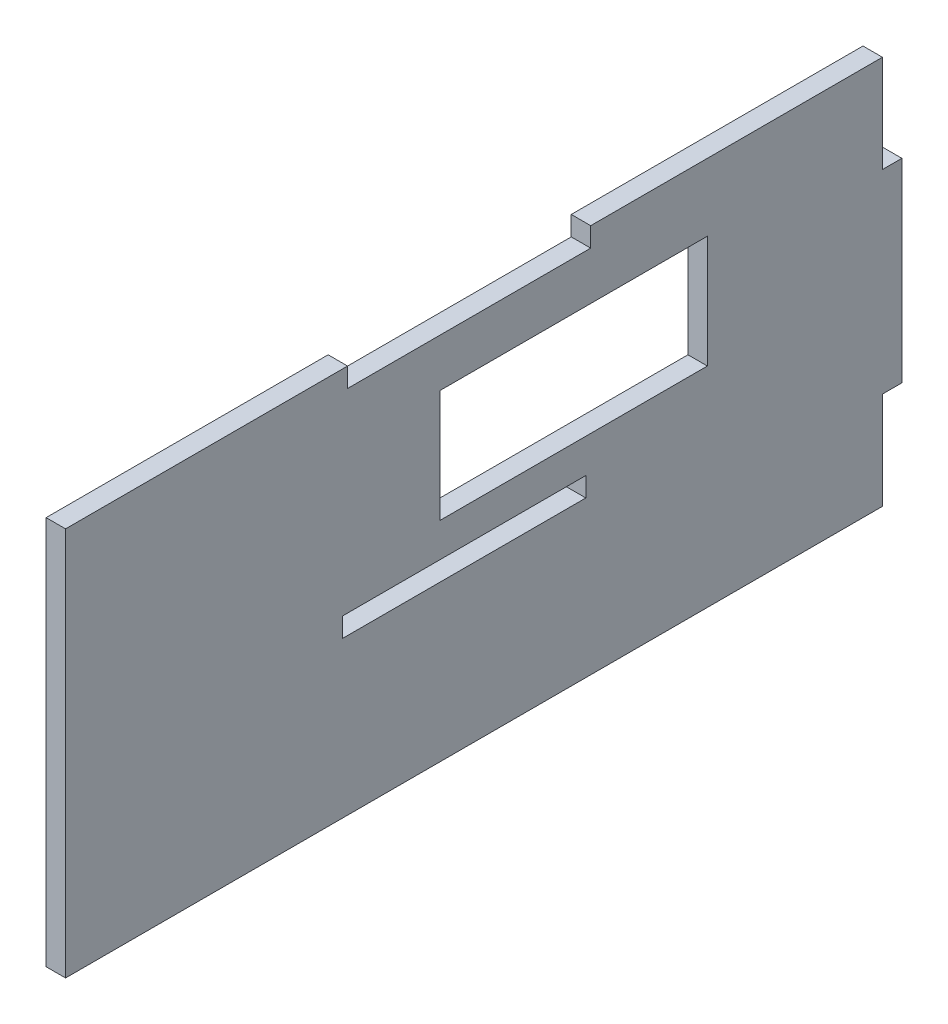
ISO-10303-21;
HEADER;
FILE_DESCRIPTION(('STEP AP214'),'2;1');
FILE_NAME('part.step','',(''),(''),'','','');
FILE_SCHEMA(('AUTOMOTIVE_DESIGN { 1 0 10303 214 1 1 1 1 }'));
ENDSEC;
DATA;
#1=APPLICATION_CONTEXT('core data for automotive mechanical design processes');
#2=APPLICATION_PROTOCOL_DEFINITION('international standard','automotive_design',2000,#1);
#3=PRODUCT_CONTEXT('',#1,'mechanical');
#4=PRODUCT('Part','Part','',(#3));
#5=PRODUCT_RELATED_PRODUCT_CATEGORY('part','',(#4));
#6=PRODUCT_DEFINITION_FORMATION('','',#4);
#7=PRODUCT_DEFINITION_CONTEXT('part definition',#1,'design');
#8=PRODUCT_DEFINITION('design','',#6,#7);
#9=PRODUCT_DEFINITION_SHAPE('','',#8);
#10=(LENGTH_UNIT() NAMED_UNIT(*) SI_UNIT(.MILLI.,.METRE.));
#11=(NAMED_UNIT(*) PLANE_ANGLE_UNIT() SI_UNIT($,.RADIAN.));
#12=(NAMED_UNIT(*) SI_UNIT($,.STERADIAN.) SOLID_ANGLE_UNIT());
#13=UNCERTAINTY_MEASURE_WITH_UNIT(LENGTH_MEASURE(1.E-05),#10,'distance_accuracy_value','');
#14=(GEOMETRIC_REPRESENTATION_CONTEXT(3) GLOBAL_UNCERTAINTY_ASSIGNED_CONTEXT((#13)) GLOBAL_UNIT_ASSIGNED_CONTEXT((#10,
#11,#12)) REPRESENTATION_CONTEXT('',''));
#15=CARTESIAN_POINT('',(0.,0.,0.));
#16=DIRECTION('',(0.,0.,1.));
#17=DIRECTION('',(1.,0.,0.));
#18=AXIS2_PLACEMENT_3D('',#15,#16,#17);
#19=CARTESIAN_POINT('',(4.,40.,87.));
#20=DIRECTION('',(0.,-1.,0.));
#21=DIRECTION('',(0.,0.,-1.));
#22=AXIS2_PLACEMENT_3D('',#19,#20,#21);
#23=PLANE('',#22);
#24=DIRECTION('',(0.,0.,1.));
#25=VECTOR('',#24,1.);
#26=CARTESIAN_POINT('',(0.,40.,87.));
#27=LINE('',#26,#25);
#28=CARTESIAN_POINT('',(0.,40.,27.));
#29=VERTEX_POINT('',#28);
#30=CARTESIAN_POINT('',(0.,40.,85.));
#31=VERTEX_POINT('',#30);
#32=EDGE_CURVE('E329',#29,#31,#27,.T.);
#33=ORIENTED_EDGE('',*,*,#32,.T.);
#34=DIRECTION('',(-1.,0.,0.));
#35=VECTOR('',#34,1.);
#36=CARTESIAN_POINT('',(10.,40.,85.));
#37=LINE('',#36,#35);
#38=CARTESIAN_POINT('',(4.,40.,85.));
#39=VERTEX_POINT('',#38);
#40=EDGE_CURVE('E251',#39,#31,#37,.T.);
#41=ORIENTED_EDGE('',*,*,#40,.F.);
#42=DIRECTION('',(0.,0.,1.));
#43=VECTOR('',#42,1.);
#44=CARTESIAN_POINT('',(4.,40.,87.));
#45=LINE('',#44,#43);
#46=CARTESIAN_POINT('',(4.,40.,27.));
#47=VERTEX_POINT('',#46);
#48=EDGE_CURVE('E325',#47,#39,#45,.T.);
#49=ORIENTED_EDGE('',*,*,#48,.F.);
#50=DIRECTION('',(1.,0.,0.));
#51=VECTOR('',#50,1.);
#52=CARTESIAN_POINT('',(0.,40.,27.));
#53=LINE('',#52,#51);
#54=EDGE_CURVE('E276',#29,#47,#53,.T.);
#55=ORIENTED_EDGE('',*,*,#54,.F.);
#56=EDGE_LOOP('',(#33,#41,#49,#55));
#57=FACE_BOUND('',#56,.T.);
#58=ADVANCED_FACE('F43',(#57),#23,.F.);
#59=CARTESIAN_POINT('',(4.,40.,-87.));
#60=DIRECTION('',(0.,0.,1.));
#61=DIRECTION('',(1.,0.,0.));
#62=AXIS2_PLACEMENT_3D('',#59,#60,#61);
#63=PLANE('',#62);
#64=DIRECTION('',(0.,1.,0.));
#65=VECTOR('',#64,1.);
#66=CARTESIAN_POINT('',(0.,40.,-87.));
#67=LINE('',#66,#65);
#68=CARTESIAN_POINT('',(0.,-20.,-87.));
#69=VERTEX_POINT('',#68);
#70=CARTESIAN_POINT('',(0.,20.,-87.));
#71=VERTEX_POINT('',#70);
#72=EDGE_CURVE('E301',#69,#71,#67,.T.);
#73=ORIENTED_EDGE('',*,*,#72,.T.);
#74=DIRECTION('',(1.,0.,0.));
#75=VECTOR('',#74,1.);
#76=CARTESIAN_POINT('',(0.,20.,-87.));
#77=LINE('',#76,#75);
#78=CARTESIAN_POINT('',(4.,20.,-87.));
#79=VERTEX_POINT('',#78);
#80=EDGE_CURVE('E298',#71,#79,#77,.T.);
#81=ORIENTED_EDGE('',*,*,#80,.T.);
#82=DIRECTION('',(0.,1.,0.));
#83=VECTOR('',#82,1.);
#84=CARTESIAN_POINT('',(4.,40.,-87.));
#85=LINE('',#84,#83);
#86=CARTESIAN_POINT('',(4.,-20.,-87.));
#87=VERTEX_POINT('',#86);
#88=EDGE_CURVE('E322',#87,#79,#85,.T.);
#89=ORIENTED_EDGE('',*,*,#88,.F.);
#90=DIRECTION('',(1.,0.,0.));
#91=VECTOR('',#90,1.);
#92=CARTESIAN_POINT('',(0.,-20.,-87.));
#93=LINE('',#92,#91);
#94=EDGE_CURVE('E305',#69,#87,#93,.T.);
#95=ORIENTED_EDGE('',*,*,#94,.F.);
#96=EDGE_LOOP('',(#73,#81,#89,#95));
#97=FACE_BOUND('',#96,.T.);
#98=ADVANCED_FACE('F45',(#97),#63,.F.);
#99=CARTESIAN_POINT('',(0.,40.,-83.));
#100=VERTEX_POINT('',#99);
#101=CARTESIAN_POINT('',(0.,40.,-23.));
#102=VERTEX_POINT('',#101);
#103=EDGE_CURVE('E330',#100,#102,#27,.T.);
#104=ORIENTED_EDGE('',*,*,#103,.T.);
#105=DIRECTION('',(1.,0.,0.));
#106=VECTOR('',#105,1.);
#107=CARTESIAN_POINT('',(0.,40.,-23.));
#108=LINE('',#107,#106);
#109=CARTESIAN_POINT('',(4.,40.,-23.));
#110=VERTEX_POINT('',#109);
#111=EDGE_CURVE('E279',#102,#110,#108,.T.);
#112=ORIENTED_EDGE('',*,*,#111,.T.);
#113=CARTESIAN_POINT('',(4.,40.,-83.));
#114=VERTEX_POINT('',#113);
#115=EDGE_CURVE('E52',#114,#110,#45,.T.);
#116=ORIENTED_EDGE('',*,*,#115,.F.);
#117=DIRECTION('',(1.,0.,0.));
#118=VECTOR('',#117,1.);
#119=CARTESIAN_POINT('',(0.,40.,-83.));
#120=LINE('',#119,#118);
#121=EDGE_CURVE('E292',#100,#114,#120,.T.);
#122=ORIENTED_EDGE('',*,*,#121,.F.);
#123=EDGE_LOOP('',(#104,#112,#116,#122));
#124=FACE_BOUND('',#123,.T.);
#125=ADVANCED_FACE('F373',(#124),#23,.F.);
#126=CARTESIAN_POINT('',(4.,-40.,87.));
#127=DIRECTION('',(0.,1.,0.));
#128=DIRECTION('',(0.,0.,1.));
#129=AXIS2_PLACEMENT_3D('',#126,#127,#128);
#130=PLANE('',#129);
#131=DIRECTION('',(0.,0.,-1.));
#132=VECTOR('',#131,1.);
#133=CARTESIAN_POINT('',(4.,-40.,87.));
#134=LINE('',#133,#132);
#135=CARTESIAN_POINT('',(4.,-40.,85.));
#136=VERTEX_POINT('',#135);
#137=CARTESIAN_POINT('',(4.,-40.,-83.));
#138=VERTEX_POINT('',#137);
#139=EDGE_CURVE('E11',#136,#138,#134,.T.);
#140=ORIENTED_EDGE('',*,*,#139,.F.);
#141=DIRECTION('',(-1.,0.,0.));
#142=VECTOR('',#141,1.);
#143=CARTESIAN_POINT('',(10.,-40.,85.));
#144=LINE('',#143,#142);
#145=CARTESIAN_POINT('',(0.,-40.,85.));
#146=VERTEX_POINT('',#145);
#147=EDGE_CURVE('E252',#136,#146,#144,.T.);
#148=ORIENTED_EDGE('',*,*,#147,.T.);
#149=DIRECTION('',(0.,0.,-1.));
#150=VECTOR('',#149,1.);
#151=CARTESIAN_POINT('',(0.,-40.,87.));
#152=LINE('',#151,#150);
#153=CARTESIAN_POINT('',(0.,-40.,-83.));
#154=VERTEX_POINT('',#153);
#155=EDGE_CURVE('E47',#146,#154,#152,.T.);
#156=ORIENTED_EDGE('',*,*,#155,.T.);
#157=DIRECTION('',(1.,0.,0.));
#158=VECTOR('',#157,1.);
#159=CARTESIAN_POINT('',(0.,-40.,-83.));
#160=LINE('',#159,#158);
#161=EDGE_CURVE('E278',#154,#138,#160,.T.);
#162=ORIENTED_EDGE('',*,*,#161,.T.);
#163=EDGE_LOOP('',(#140,#148,#156,#162));
#164=FACE_BOUND('',#163,.T.);
#165=ADVANCED_FACE('F351',(#164),#130,.F.);
#166=CARTESIAN_POINT('',(4.,0.,0.));
#167=DIRECTION('',(1.,0.,0.));
#168=DIRECTION('',(0.,0.,-1.));
#169=AXIS2_PLACEMENT_3D('',#166,#167,#168);
#170=PLANE('',#169);
#171=DIRECTION('',(0.,-1.,0.));
#172=VECTOR('',#171,1.);
#173=CARTESIAN_POINT('',(4.,26.130254533586,-47.));
#174=LINE('',#173,#172);
#175=CARTESIAN_POINT('',(4.,26.130254533586,-47.));
#176=VERTEX_POINT('',#175);
#177=CARTESIAN_POINT('',(4.,3.,-47.));
#178=VERTEX_POINT('',#177);
#179=EDGE_CURVE('E183',#176,#178,#174,.T.);
#180=ORIENTED_EDGE('',*,*,#179,.T.);
#181=DIRECTION('',(0.,0.,1.));
#182=VECTOR('',#181,1.);
#183=CARTESIAN_POINT('',(4.,3.,-47.));
#184=LINE('',#183,#182);
#185=CARTESIAN_POINT('',(4.,3.,8.));
#186=VERTEX_POINT('',#185);
#187=EDGE_CURVE('E192',#178,#186,#184,.T.);
#188=ORIENTED_EDGE('',*,*,#187,.T.);
#189=DIRECTION('',(0.,1.,0.));
#190=VECTOR('',#189,1.);
#191=CARTESIAN_POINT('',(4.,26.130254533586,7.99999999999999));
#192=LINE('',#191,#190);
#193=CARTESIAN_POINT('',(4.,26.130254533586,7.99999999999999));
#194=VERTEX_POINT('',#193);
#195=EDGE_CURVE('E60',#186,#194,#192,.T.);
#196=ORIENTED_EDGE('',*,*,#195,.T.);
#197=DIRECTION('',(0.,0.,-1.));
#198=VECTOR('',#197,1.);
#199=CARTESIAN_POINT('',(4.,26.130254533586,-47.));
#200=LINE('',#199,#198);
#201=EDGE_CURVE('E189',#194,#176,#200,.T.);
#202=ORIENTED_EDGE('',*,*,#201,.T.);
#203=EDGE_LOOP('',(#180,#188,#196,#202));
#204=FACE_BOUND('',#203,.T.);
#205=DIRECTION('',(0.,-1.,0.));
#206=VECTOR('',#205,1.);
#207=CARTESIAN_POINT('',(4.,-4.,-22.));
#208=LINE('',#207,#206);
#209=CARTESIAN_POINT('',(4.,-4.,-22.));
#210=VERTEX_POINT('',#209);
#211=CARTESIAN_POINT('',(4.,-8.,-22.));
#212=VERTEX_POINT('',#211);
#213=EDGE_CURVE('E218',#210,#212,#208,.T.);
#214=ORIENTED_EDGE('',*,*,#213,.T.);
#215=DIRECTION('',(0.,0.,1.));
#216=VECTOR('',#215,1.);
#217=CARTESIAN_POINT('',(4.,-8.,-22.));
#218=LINE('',#217,#216);
#219=CARTESIAN_POINT('',(4.,-8.,28.));
#220=VERTEX_POINT('',#219);
#221=EDGE_CURVE('E221',#212,#220,#218,.T.);
#222=ORIENTED_EDGE('',*,*,#221,.T.);
#223=DIRECTION('',(0.,1.,0.));
#224=VECTOR('',#223,1.);
#225=CARTESIAN_POINT('',(4.,-4.,28.));
#226=LINE('',#225,#224);
#227=CARTESIAN_POINT('',(4.,-4.,28.));
#228=VERTEX_POINT('',#227);
#229=EDGE_CURVE('E225',#220,#228,#226,.T.);
#230=ORIENTED_EDGE('',*,*,#229,.T.);
#231=DIRECTION('',(0.,0.,-1.));
#232=VECTOR('',#231,1.);
#233=CARTESIAN_POINT('',(4.,-4.,-22.));
#234=LINE('',#233,#232);
#235=EDGE_CURVE('E228',#228,#210,#234,.T.);
#236=ORIENTED_EDGE('',*,*,#235,.T.);
#237=EDGE_LOOP('',(#214,#222,#230,#236));
#238=FACE_BOUND('',#237,.T.);
#239=DIRECTION('',(0.,1.,0.));
#240=VECTOR('',#239,1.);
#241=CARTESIAN_POINT('',(4.,0.,85.));
#242=LINE('',#241,#240);
#243=EDGE_CURVE('E255',#136,#39,#242,.T.);
#244=ORIENTED_EDGE('',*,*,#243,.F.);
#245=ORIENTED_EDGE('',*,*,#139,.T.);
#246=DIRECTION('',(0.,-1.,0.));
#247=VECTOR('',#246,1.);
#248=CARTESIAN_POINT('',(4.,-40.,-83.));
#249=LINE('',#248,#247);
#250=CARTESIAN_POINT('',(4.,-20.,-83.));
#251=VERTEX_POINT('',#250);
#252=EDGE_CURVE('E312',#251,#138,#249,.T.);
#253=ORIENTED_EDGE('',*,*,#252,.F.);
#254=DIRECTION('',(0.,0.,1.));
#255=VECTOR('',#254,1.);
#256=CARTESIAN_POINT('',(4.,-20.,-87.));
#257=LINE('',#256,#255);
#258=EDGE_CURVE('E296',#87,#251,#257,.T.);
#259=ORIENTED_EDGE('',*,*,#258,.F.);
#260=ORIENTED_EDGE('',*,*,#88,.T.);
#261=DIRECTION('',(0.,0.,-1.));
#262=VECTOR('',#261,1.);
#263=CARTESIAN_POINT('',(4.,20.,-87.));
#264=LINE('',#263,#262);
#265=CARTESIAN_POINT('',(4.,20.,-83.));
#266=VERTEX_POINT('',#265);
#267=EDGE_CURVE('E289',#266,#79,#264,.T.);
#268=ORIENTED_EDGE('',*,*,#267,.F.);
#269=DIRECTION('',(0.,-1.,0.));
#270=VECTOR('',#269,1.);
#271=CARTESIAN_POINT('',(4.,40.,-83.));
#272=LINE('',#271,#270);
#273=EDGE_CURVE('E293',#114,#266,#272,.T.);
#274=ORIENTED_EDGE('',*,*,#273,.F.);
#275=ORIENTED_EDGE('',*,*,#115,.T.);
#276=DIRECTION('',(0.,1.,0.));
#277=VECTOR('',#276,1.);
#278=CARTESIAN_POINT('',(4.,40.,-23.));
#279=LINE('',#278,#277);
#280=CARTESIAN_POINT('',(4.,36.,-23.));
#281=VERTEX_POINT('',#280);
#282=EDGE_CURVE('E263',#281,#110,#279,.T.);
#283=ORIENTED_EDGE('',*,*,#282,.F.);
#284=DIRECTION('',(0.,0.,-1.));
#285=VECTOR('',#284,1.);
#286=CARTESIAN_POINT('',(4.,36.,27.));
#287=LINE('',#286,#285);
#288=CARTESIAN_POINT('',(4.,36.,27.));
#289=VERTEX_POINT('',#288);
#290=EDGE_CURVE('E272',#289,#281,#287,.T.);
#291=ORIENTED_EDGE('',*,*,#290,.F.);
#292=DIRECTION('',(0.,-1.,0.));
#293=VECTOR('',#292,1.);
#294=CARTESIAN_POINT('',(4.,40.,27.));
#295=LINE('',#294,#293);
#296=EDGE_CURVE('E258',#47,#289,#295,.T.);
#297=ORIENTED_EDGE('',*,*,#296,.F.);
#298=ORIENTED_EDGE('',*,*,#48,.T.);
#299=EDGE_LOOP('',(#244,#245,#253,#259,#260,#268,#274,#275,#283,#291,#297,#298));
#300=FACE_BOUND('',#299,.T.);
#301=ADVANCED_FACE('F196',(#204,#238,#300),#170,.T.);
#302=CARTESIAN_POINT('',(0.,0.,0.));
#303=DIRECTION('',(1.,0.,0.));
#304=DIRECTION('',(0.,0.,-1.));
#305=AXIS2_PLACEMENT_3D('',#302,#303,#304);
#306=PLANE('',#305);
#307=DIRECTION('',(0.,0.,1.));
#308=VECTOR('',#307,1.);
#309=CARTESIAN_POINT('',(0.,3.,-47.));
#310=LINE('',#309,#308);
#311=CARTESIAN_POINT('',(0.,3.,-47.));
#312=VERTEX_POINT('',#311);
#313=CARTESIAN_POINT('',(0.,3.,8.));
#314=VERTEX_POINT('',#313);
#315=EDGE_CURVE('E208',#312,#314,#310,.T.);
#316=ORIENTED_EDGE('',*,*,#315,.F.);
#317=DIRECTION('',(0.,-1.,0.));
#318=VECTOR('',#317,1.);
#319=CARTESIAN_POINT('',(0.,26.130254533586,-47.));
#320=LINE('',#319,#318);
#321=CARTESIAN_POINT('',(0.,26.130254533586,-47.));
#322=VERTEX_POINT('',#321);
#323=EDGE_CURVE('E68',#322,#312,#320,.T.);
#324=ORIENTED_EDGE('',*,*,#323,.F.);
#325=DIRECTION('',(0.,0.,-1.));
#326=VECTOR('',#325,1.);
#327=CARTESIAN_POINT('',(0.,26.130254533586,-47.));
#328=LINE('',#327,#326);
#329=CARTESIAN_POINT('',(0.,26.130254533586,7.99999999999999));
#330=VERTEX_POINT('',#329);
#331=EDGE_CURVE('E199',#330,#322,#328,.T.);
#332=ORIENTED_EDGE('',*,*,#331,.F.);
#333=DIRECTION('',(0.,1.,0.));
#334=VECTOR('',#333,1.);
#335=CARTESIAN_POINT('',(0.,26.130254533586,7.99999999999999));
#336=LINE('',#335,#334);
#337=EDGE_CURVE('E202',#314,#330,#336,.T.);
#338=ORIENTED_EDGE('',*,*,#337,.F.);
#339=EDGE_LOOP('',(#316,#324,#332,#338));
#340=FACE_BOUND('',#339,.T.);
#341=DIRECTION('',(0.,0.,1.));
#342=VECTOR('',#341,1.);
#343=CARTESIAN_POINT('',(0.,-8.,-22.));
#344=LINE('',#343,#342);
#345=CARTESIAN_POINT('',(0.,-8.,-22.));
#346=VERTEX_POINT('',#345);
#347=CARTESIAN_POINT('',(0.,-8.,28.));
#348=VERTEX_POINT('',#347);
#349=EDGE_CURVE('E233',#346,#348,#344,.T.);
#350=ORIENTED_EDGE('',*,*,#349,.F.);
#351=DIRECTION('',(0.,-1.,0.));
#352=VECTOR('',#351,1.);
#353=CARTESIAN_POINT('',(0.,-4.,-22.));
#354=LINE('',#353,#352);
#355=CARTESIAN_POINT('',(0.,-4.,-22.));
#356=VERTEX_POINT('',#355);
#357=EDGE_CURVE('E214',#356,#346,#354,.T.);
#358=ORIENTED_EDGE('',*,*,#357,.F.);
#359=DIRECTION('',(0.,0.,-1.));
#360=VECTOR('',#359,1.);
#361=CARTESIAN_POINT('',(0.,-4.,-22.));
#362=LINE('',#361,#360);
#363=CARTESIAN_POINT('',(0.,-4.,28.));
#364=VERTEX_POINT('',#363);
#365=EDGE_CURVE('E222',#364,#356,#362,.T.);
#366=ORIENTED_EDGE('',*,*,#365,.F.);
#367=DIRECTION('',(0.,1.,0.));
#368=VECTOR('',#367,1.);
#369=CARTESIAN_POINT('',(0.,-4.,28.));
#370=LINE('',#369,#368);
#371=EDGE_CURVE('E236',#348,#364,#370,.T.);
#372=ORIENTED_EDGE('',*,*,#371,.F.);
#373=EDGE_LOOP('',(#350,#358,#366,#372));
#374=FACE_BOUND('',#373,.T.);
#375=ORIENTED_EDGE('',*,*,#155,.F.);
#376=DIRECTION('',(0.,-1.,0.));
#377=VECTOR('',#376,1.);
#378=CARTESIAN_POINT('',(0.,-40.,85.));
#379=LINE('',#378,#377);
#380=EDGE_CURVE('E243',#31,#146,#379,.T.);
#381=ORIENTED_EDGE('',*,*,#380,.F.);
#382=ORIENTED_EDGE('',*,*,#32,.F.);
#383=DIRECTION('',(0.,-1.,0.));
#384=VECTOR('',#383,1.);
#385=CARTESIAN_POINT('',(0.,40.,27.));
#386=LINE('',#385,#384);
#387=CARTESIAN_POINT('',(0.,36.,27.));
#388=VERTEX_POINT('',#387);
#389=EDGE_CURVE('E259',#29,#388,#386,.T.);
#390=ORIENTED_EDGE('',*,*,#389,.T.);
#391=DIRECTION('',(0.,0.,-1.));
#392=VECTOR('',#391,1.);
#393=CARTESIAN_POINT('',(0.,36.,27.));
#394=LINE('',#393,#392);
#395=CARTESIAN_POINT('',(0.,36.,-23.));
#396=VERTEX_POINT('',#395);
#397=EDGE_CURVE('E262',#388,#396,#394,.T.);
#398=ORIENTED_EDGE('',*,*,#397,.T.);
#399=DIRECTION('',(0.,1.,0.));
#400=VECTOR('',#399,1.);
#401=CARTESIAN_POINT('',(0.,40.,-23.));
#402=LINE('',#401,#400);
#403=EDGE_CURVE('E266',#396,#102,#402,.T.);
#404=ORIENTED_EDGE('',*,*,#403,.T.);
#405=ORIENTED_EDGE('',*,*,#103,.F.);
#406=DIRECTION('',(0.,-1.,0.));
#407=VECTOR('',#406,1.);
#408=CARTESIAN_POINT('',(0.,40.,-83.));
#409=LINE('',#408,#407);
#410=CARTESIAN_POINT('',(0.,20.,-83.));
#411=VERTEX_POINT('',#410);
#412=EDGE_CURVE('E285',#100,#411,#409,.T.);
#413=ORIENTED_EDGE('',*,*,#412,.T.);
#414=DIRECTION('',(0.,0.,-1.));
#415=VECTOR('',#414,1.);
#416=CARTESIAN_POINT('',(0.,20.,-87.));
#417=LINE('',#416,#415);
#418=EDGE_CURVE('E288',#411,#71,#417,.T.);
#419=ORIENTED_EDGE('',*,*,#418,.T.);
#420=ORIENTED_EDGE('',*,*,#72,.F.);
#421=DIRECTION('',(0.,0.,1.));
#422=VECTOR('',#421,1.);
#423=CARTESIAN_POINT('',(0.,-20.,-87.));
#424=LINE('',#423,#422);
#425=CARTESIAN_POINT('',(0.,-20.,-83.));
#426=VERTEX_POINT('',#425);
#427=EDGE_CURVE('E315',#69,#426,#424,.T.);
#428=ORIENTED_EDGE('',*,*,#427,.T.);
#429=DIRECTION('',(0.,-1.,0.));
#430=VECTOR('',#429,1.);
#431=CARTESIAN_POINT('',(0.,-40.,-83.));
#432=LINE('',#431,#430);
#433=EDGE_CURVE('E307',#426,#154,#432,.T.);
#434=ORIENTED_EDGE('',*,*,#433,.T.);
#435=EDGE_LOOP('',(#375,#381,#382,#390,#398,#404,#405,#413,#419,#420,#428,#434));
#436=FACE_BOUND('',#435,.T.);
#437=ADVANCED_FACE('F345',(#340,#374,#436),#306,.F.);
#438=CARTESIAN_POINT('',(0.,-40.,-83.));
#439=DIRECTION('',(0.,0.,1.));
#440=DIRECTION('',(1.,0.,0.));
#441=AXIS2_PLACEMENT_3D('',#438,#439,#440);
#442=PLANE('',#441);
#443=ORIENTED_EDGE('',*,*,#252,.T.);
#444=ORIENTED_EDGE('',*,*,#161,.F.);
#445=ORIENTED_EDGE('',*,*,#433,.F.);
#446=DIRECTION('',(1.,0.,0.));
#447=VECTOR('',#446,1.);
#448=CARTESIAN_POINT('',(0.,-20.,-83.));
#449=LINE('',#448,#447);
#450=EDGE_CURVE('E308',#426,#251,#449,.T.);
#451=ORIENTED_EDGE('',*,*,#450,.T.);
#452=EDGE_LOOP('',(#443,#444,#445,#451));
#453=FACE_BOUND('',#452,.T.);
#454=ADVANCED_FACE('F357',(#453),#442,.F.);
#455=CARTESIAN_POINT('',(0.,-20.,-87.));
#456=DIRECTION('',(0.,1.,0.));
#457=DIRECTION('',(0.,0.,1.));
#458=AXIS2_PLACEMENT_3D('',#455,#456,#457);
#459=PLANE('',#458);
#460=ORIENTED_EDGE('',*,*,#258,.T.);
#461=ORIENTED_EDGE('',*,*,#450,.F.);
#462=ORIENTED_EDGE('',*,*,#427,.F.);
#463=ORIENTED_EDGE('',*,*,#94,.T.);
#464=EDGE_LOOP('',(#460,#461,#462,#463));
#465=FACE_BOUND('',#464,.T.);
#466=ADVANCED_FACE('F360',(#465),#459,.F.);
#467=CARTESIAN_POINT('',(0.,20.,-87.));
#468=DIRECTION('',(0.,-1.,0.));
#469=DIRECTION('',(0.,0.,-1.));
#470=AXIS2_PLACEMENT_3D('',#467,#468,#469);
#471=PLANE('',#470);
#472=ORIENTED_EDGE('',*,*,#267,.T.);
#473=ORIENTED_EDGE('',*,*,#80,.F.);
#474=ORIENTED_EDGE('',*,*,#418,.F.);
#475=DIRECTION('',(1.,0.,0.));
#476=VECTOR('',#475,1.);
#477=CARTESIAN_POINT('',(0.,20.,-83.));
#478=LINE('',#477,#476);
#479=EDGE_CURVE('E302',#411,#266,#478,.T.);
#480=ORIENTED_EDGE('',*,*,#479,.T.);
#481=EDGE_LOOP('',(#472,#473,#474,#480));
#482=FACE_BOUND('',#481,.T.);
#483=ADVANCED_FACE('F367',(#482),#471,.F.);
#484=CARTESIAN_POINT('',(0.,40.,-83.));
#485=DIRECTION('',(0.,0.,1.));
#486=DIRECTION('',(1.,0.,0.));
#487=AXIS2_PLACEMENT_3D('',#484,#485,#486);
#488=PLANE('',#487);
#489=ORIENTED_EDGE('',*,*,#273,.T.);
#490=ORIENTED_EDGE('',*,*,#479,.F.);
#491=ORIENTED_EDGE('',*,*,#412,.F.);
#492=ORIENTED_EDGE('',*,*,#121,.T.);
#493=EDGE_LOOP('',(#489,#490,#491,#492));
#494=FACE_BOUND('',#493,.T.);
#495=ADVANCED_FACE('F370',(#494),#488,.F.);
#496=CARTESIAN_POINT('',(0.,40.,27.));
#497=DIRECTION('',(0.,0.,1.));
#498=DIRECTION('',(1.,0.,0.));
#499=AXIS2_PLACEMENT_3D('',#496,#497,#498);
#500=PLANE('',#499);
#501=ORIENTED_EDGE('',*,*,#296,.T.);
#502=DIRECTION('',(1.,0.,0.));
#503=VECTOR('',#502,1.);
#504=CARTESIAN_POINT('',(0.,36.,27.));
#505=LINE('',#504,#503);
#506=EDGE_CURVE('E269',#388,#289,#505,.T.);
#507=ORIENTED_EDGE('',*,*,#506,.F.);
#508=ORIENTED_EDGE('',*,*,#389,.F.);
#509=ORIENTED_EDGE('',*,*,#54,.T.);
#510=EDGE_LOOP('',(#501,#507,#508,#509));
#511=FACE_BOUND('',#510,.T.);
#512=ADVANCED_FACE('F384',(#511),#500,.F.);
#513=CARTESIAN_POINT('',(0.,40.,-23.));
#514=DIRECTION('',(0.,0.,-1.));
#515=DIRECTION('',(-1.,0.,0.));
#516=AXIS2_PLACEMENT_3D('',#513,#514,#515);
#517=PLANE('',#516);
#518=ORIENTED_EDGE('',*,*,#282,.T.);
#519=ORIENTED_EDGE('',*,*,#111,.F.);
#520=ORIENTED_EDGE('',*,*,#403,.F.);
#521=DIRECTION('',(1.,0.,0.));
#522=VECTOR('',#521,1.);
#523=CARTESIAN_POINT('',(0.,36.,-23.));
#524=LINE('',#523,#522);
#525=EDGE_CURVE('E282',#396,#281,#524,.T.);
#526=ORIENTED_EDGE('',*,*,#525,.T.);
#527=EDGE_LOOP('',(#518,#519,#520,#526));
#528=FACE_BOUND('',#527,.T.);
#529=ADVANCED_FACE('F378',(#528),#517,.F.);
#530=CARTESIAN_POINT('',(0.,36.,27.));
#531=DIRECTION('',(0.,-1.,0.));
#532=DIRECTION('',(0.,0.,-1.));
#533=AXIS2_PLACEMENT_3D('',#530,#531,#532);
#534=PLANE('',#533);
#535=ORIENTED_EDGE('',*,*,#290,.T.);
#536=ORIENTED_EDGE('',*,*,#525,.F.);
#537=ORIENTED_EDGE('',*,*,#397,.F.);
#538=ORIENTED_EDGE('',*,*,#506,.T.);
#539=EDGE_LOOP('',(#535,#536,#537,#538));
#540=FACE_BOUND('',#539,.T.);
#541=ADVANCED_FACE('F382',(#540),#534,.F.);
#542=CARTESIAN_POINT('',(10.,-40.,85.));
#543=DIRECTION('',(0.,0.,-1.));
#544=DIRECTION('',(-1.,0.,0.));
#545=AXIS2_PLACEMENT_3D('',#542,#543,#544);
#546=PLANE('',#545);
#547=ORIENTED_EDGE('',*,*,#243,.T.);
#548=ORIENTED_EDGE('',*,*,#40,.T.);
#549=ORIENTED_EDGE('',*,*,#380,.T.);
#550=ORIENTED_EDGE('',*,*,#147,.F.);
#551=EDGE_LOOP('',(#547,#548,#549,#550));
#552=FACE_BOUND('',#551,.T.);
#553=ADVANCED_FACE('F347',(#552),#546,.F.);
#554=CARTESIAN_POINT('',(4.,-4.,-22.));
#555=DIRECTION('',(0.,0.,-1.));
#556=DIRECTION('',(0.,1.,0.));
#557=AXIS2_PLACEMENT_3D('',#554,#555,#556);
#558=PLANE('',#557);
#559=ORIENTED_EDGE('',*,*,#357,.T.);
#560=DIRECTION('',(-1.,0.,0.));
#561=VECTOR('',#560,1.);
#562=CARTESIAN_POINT('',(4.,-8.,-22.));
#563=LINE('',#562,#561);
#564=EDGE_CURVE('E231',#212,#346,#563,.T.);
#565=ORIENTED_EDGE('',*,*,#564,.F.);
#566=ORIENTED_EDGE('',*,*,#213,.F.);
#567=DIRECTION('',(-1.,0.,0.));
#568=VECTOR('',#567,1.);
#569=CARTESIAN_POINT('',(4.,-4.,-22.));
#570=LINE('',#569,#568);
#571=EDGE_CURVE('E241',#210,#356,#570,.T.);
#572=ORIENTED_EDGE('',*,*,#571,.T.);
#573=EDGE_LOOP('',(#559,#565,#566,#572));
#574=FACE_BOUND('',#573,.T.);
#575=ADVANCED_FACE('F462',(#574),#558,.F.);
#576=CARTESIAN_POINT('',(4.,-4.,-22.));
#577=DIRECTION('',(0.,1.,0.));
#578=DIRECTION('',(0.,0.,1.));
#579=AXIS2_PLACEMENT_3D('',#576,#577,#578);
#580=PLANE('',#579);
#581=ORIENTED_EDGE('',*,*,#365,.T.);
#582=ORIENTED_EDGE('',*,*,#571,.F.);
#583=ORIENTED_EDGE('',*,*,#235,.F.);
#584=DIRECTION('',(-1.,0.,0.));
#585=VECTOR('',#584,1.);
#586=CARTESIAN_POINT('',(4.,-4.,28.));
#587=LINE('',#586,#585);
#588=EDGE_CURVE('E244',#228,#364,#587,.T.);
#589=ORIENTED_EDGE('',*,*,#588,.T.);
#590=EDGE_LOOP('',(#581,#582,#583,#589));
#591=FACE_BOUND('',#590,.T.);
#592=ADVANCED_FACE('F468',(#591),#580,.F.);
#593=CARTESIAN_POINT('',(4.,-4.,28.));
#594=DIRECTION('',(0.,0.,1.));
#595=DIRECTION('',(0.,-1.,0.));
#596=AXIS2_PLACEMENT_3D('',#593,#594,#595);
#597=PLANE('',#596);
#598=ORIENTED_EDGE('',*,*,#371,.T.);
#599=ORIENTED_EDGE('',*,*,#588,.F.);
#600=ORIENTED_EDGE('',*,*,#229,.F.);
#601=DIRECTION('',(-1.,0.,0.));
#602=VECTOR('',#601,1.);
#603=CARTESIAN_POINT('',(4.,-8.,28.));
#604=LINE('',#603,#602);
#605=EDGE_CURVE('E246',#220,#348,#604,.T.);
#606=ORIENTED_EDGE('',*,*,#605,.T.);
#607=EDGE_LOOP('',(#598,#599,#600,#606));
#608=FACE_BOUND('',#607,.T.);
#609=ADVANCED_FACE('F476',(#608),#597,.F.);
#610=CARTESIAN_POINT('',(4.,-8.,-22.));
#611=DIRECTION('',(0.,-1.,0.));
#612=DIRECTION('',(0.,0.,-1.));
#613=AXIS2_PLACEMENT_3D('',#610,#611,#612);
#614=PLANE('',#613);
#615=ORIENTED_EDGE('',*,*,#349,.T.);
#616=ORIENTED_EDGE('',*,*,#605,.F.);
#617=ORIENTED_EDGE('',*,*,#221,.F.);
#618=ORIENTED_EDGE('',*,*,#564,.T.);
#619=EDGE_LOOP('',(#615,#616,#617,#618));
#620=FACE_BOUND('',#619,.T.);
#621=ADVANCED_FACE('F484',(#620),#614,.F.);
#622=CARTESIAN_POINT('',(4.,26.130254533586,-47.));
#623=DIRECTION('',(0.,0.,-1.));
#624=DIRECTION('',(-1.,0.,0.));
#625=AXIS2_PLACEMENT_3D('',#622,#623,#624);
#626=PLANE('',#625);
#627=ORIENTED_EDGE('',*,*,#323,.T.);
#628=DIRECTION('',(-1.,0.,0.));
#629=VECTOR('',#628,1.);
#630=CARTESIAN_POINT('',(4.,3.,-47.));
#631=LINE('',#630,#629);
#632=EDGE_CURVE('E179',#178,#312,#631,.T.);
#633=ORIENTED_EDGE('',*,*,#632,.F.);
#634=ORIENTED_EDGE('',*,*,#179,.F.);
#635=DIRECTION('',(-1.,0.,0.));
#636=VECTOR('',#635,1.);
#637=CARTESIAN_POINT('',(4.,26.130254533586,-47.));
#638=LINE('',#637,#636);
#639=EDGE_CURVE('E212',#176,#322,#638,.T.);
#640=ORIENTED_EDGE('',*,*,#639,.T.);
#641=EDGE_LOOP('',(#627,#633,#634,#640));
#642=FACE_BOUND('',#641,.T.);
#643=ADVANCED_FACE('F181',(#642),#626,.F.);
#644=CARTESIAN_POINT('',(4.,26.130254533586,-47.));
#645=DIRECTION('',(0.,1.,0.));
#646=DIRECTION('',(0.,0.,1.));
#647=AXIS2_PLACEMENT_3D('',#644,#645,#646);
#648=PLANE('',#647);
#649=ORIENTED_EDGE('',*,*,#331,.T.);
#650=ORIENTED_EDGE('',*,*,#639,.F.);
#651=ORIENTED_EDGE('',*,*,#201,.F.);
#652=DIRECTION('',(-1.,0.,0.));
#653=VECTOR('',#652,1.);
#654=CARTESIAN_POINT('',(4.,26.130254533586,7.99999999999999));
#655=LINE('',#654,#653);
#656=EDGE_CURVE('E215',#194,#330,#655,.T.);
#657=ORIENTED_EDGE('',*,*,#656,.T.);
#658=EDGE_LOOP('',(#649,#650,#651,#657));
#659=FACE_BOUND('',#658,.T.);
#660=ADVANCED_FACE('F499',(#659),#648,.F.);
#661=CARTESIAN_POINT('',(4.,26.130254533586,7.99999999999999));
#662=DIRECTION('',(0.,0.,1.));
#663=DIRECTION('',(0.,-1.,0.));
#664=AXIS2_PLACEMENT_3D('',#661,#662,#663);
#665=PLANE('',#664);
#666=ORIENTED_EDGE('',*,*,#337,.T.);
#667=ORIENTED_EDGE('',*,*,#656,.F.);
#668=ORIENTED_EDGE('',*,*,#195,.F.);
#669=DIRECTION('',(-1.,0.,0.));
#670=VECTOR('',#669,1.);
#671=CARTESIAN_POINT('',(4.,3.,8.));
#672=LINE('',#671,#670);
#673=EDGE_CURVE('E188',#186,#314,#672,.T.);
#674=ORIENTED_EDGE('',*,*,#673,.T.);
#675=EDGE_LOOP('',(#666,#667,#668,#674));
#676=FACE_BOUND('',#675,.T.);
#677=ADVANCED_FACE('F506',(#676),#665,.F.);
#678=CARTESIAN_POINT('',(4.,3.,-47.));
#679=DIRECTION('',(0.,-1.,0.));
#680=DIRECTION('',(0.,0.,-1.));
#681=AXIS2_PLACEMENT_3D('',#678,#679,#680);
#682=PLANE('',#681);
#683=ORIENTED_EDGE('',*,*,#315,.T.);
#684=ORIENTED_EDGE('',*,*,#673,.F.);
#685=ORIENTED_EDGE('',*,*,#187,.F.);
#686=ORIENTED_EDGE('',*,*,#632,.T.);
#687=EDGE_LOOP('',(#683,#684,#685,#686));
#688=FACE_BOUND('',#687,.T.);
#689=ADVANCED_FACE('F193',(#688),#682,.F.);
#690=CLOSED_SHELL('',(#58,#98,#125,#165,#301,#437,#454,#466,#483,#495,#512,#529,#541,#553,#575,
#592,#609,#621,#643,#660,#677,#689));
#691=MANIFOLD_SOLID_BREP('B2',#690);
#692=ADVANCED_BREP_SHAPE_REPRESENTATION('',(#18,#691),#14);
#693=SHAPE_DEFINITION_REPRESENTATION(#9,#692);
ENDSEC;
END-ISO-10303-21;
